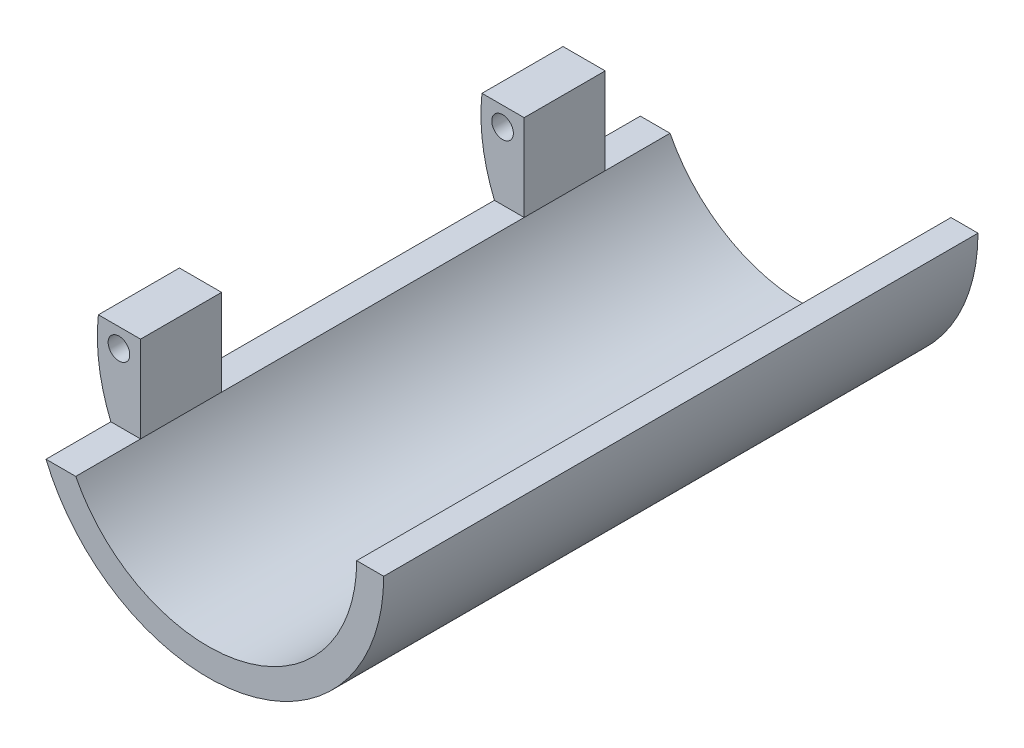
ISO-10303-21;
HEADER;
FILE_DESCRIPTION(('STEP AP214'),'2;1');
FILE_NAME('part.step','',(''),(''),'','','');
FILE_SCHEMA(('AUTOMOTIVE_DESIGN { 1 0 10303 214 1 1 1 1 }'));
ENDSEC;
DATA;
#1=APPLICATION_CONTEXT('core data for automotive mechanical design processes');
#2=APPLICATION_PROTOCOL_DEFINITION('international standard','automotive_design',2000,#1);
#3=PRODUCT_CONTEXT('',#1,'mechanical');
#4=PRODUCT('Part','Part','',(#3));
#5=PRODUCT_RELATED_PRODUCT_CATEGORY('part','',(#4));
#6=PRODUCT_DEFINITION_FORMATION('','',#4);
#7=PRODUCT_DEFINITION_CONTEXT('part definition',#1,'design');
#8=PRODUCT_DEFINITION('design','',#6,#7);
#9=PRODUCT_DEFINITION_SHAPE('','',#8);
#10=(LENGTH_UNIT() NAMED_UNIT(*) SI_UNIT(.MILLI.,.METRE.));
#11=(NAMED_UNIT(*) PLANE_ANGLE_UNIT() SI_UNIT($,.RADIAN.));
#12=(NAMED_UNIT(*) SI_UNIT($,.STERADIAN.) SOLID_ANGLE_UNIT());
#13=UNCERTAINTY_MEASURE_WITH_UNIT(LENGTH_MEASURE(1.E-05),#10,'distance_accuracy_value','');
#14=(GEOMETRIC_REPRESENTATION_CONTEXT(3) GLOBAL_UNCERTAINTY_ASSIGNED_CONTEXT((#13)) GLOBAL_UNIT_ASSIGNED_CONTEXT((#10,
#11,#12)) REPRESENTATION_CONTEXT('',''));
#15=CARTESIAN_POINT('',(0.,0.,0.));
#16=DIRECTION('',(0.,0.,1.));
#17=DIRECTION('',(1.,0.,0.));
#18=AXIS2_PLACEMENT_3D('',#15,#16,#17);
#19=CARTESIAN_POINT('',(-24.5,3.5100040032032,110.));
#20=DIRECTION('',(-1.,0.,0.));
#21=DIRECTION('',(0.,-1.,0.));
#22=AXIS2_PLACEMENT_3D('',#19,#20,#21);
#23=PLANE('',#22);
#24=DIRECTION('',(0.,0.,-1.));
#25=VECTOR('',#24,1.);
#26=CARTESIAN_POINT('',(-24.5,-12.4899959967968,110.));
#27=LINE('',#26,#25);
#28=CARTESIAN_POINT('',(-24.5,-12.4899959967968,98.));
#29=VERTEX_POINT('',#28);
#30=CARTESIAN_POINT('',(-24.5,-12.4899959967968,83.));
#31=VERTEX_POINT('',#30);
#32=EDGE_CURVE('E41',#29,#31,#27,.T.);
#33=ORIENTED_EDGE('',*,*,#32,.T.);
#34=DIRECTION('',(0.,-1.,0.));
#35=VECTOR('',#34,1.);
#36=CARTESIAN_POINT('',(-24.5,3.5100040032032,83.));
#37=LINE('',#36,#35);
#38=CARTESIAN_POINT('',(-24.5,3.5100040032032,83.));
#39=VERTEX_POINT('',#38);
#40=EDGE_CURVE('E170',#39,#31,#37,.T.);
#41=ORIENTED_EDGE('',*,*,#40,.F.);
#42=DIRECTION('',(0.,0.,-1.));
#43=VECTOR('',#42,1.);
#44=CARTESIAN_POINT('',(-24.5,3.5100040032032,110.));
#45=LINE('',#44,#43);
#46=CARTESIAN_POINT('',(-24.5,3.5100040032032,98.));
#47=VERTEX_POINT('',#46);
#48=EDGE_CURVE('E154',#47,#39,#45,.T.);
#49=ORIENTED_EDGE('',*,*,#48,.F.);
#50=DIRECTION('',(0.,1.,0.));
#51=VECTOR('',#50,1.);
#52=CARTESIAN_POINT('',(-24.5,3.5100040032032,98.));
#53=LINE('',#52,#51);
#54=EDGE_CURVE('E171',#29,#47,#53,.T.);
#55=ORIENTED_EDGE('',*,*,#54,.F.);
#56=EDGE_LOOP('',(#33,#41,#49,#55));
#57=FACE_BOUND('',#56,.T.);
#58=ADVANCED_FACE('F33',(#57),#23,.F.);
#59=CARTESIAN_POINT('',(-24.5,3.5100040032032,110.));
#60=DIRECTION('',(0.,-1.,0.));
#61=DIRECTION('',(1.,0.,0.));
#62=AXIS2_PLACEMENT_3D('',#59,#60,#61);
#63=PLANE('',#62);
#64=ORIENTED_EDGE('',*,*,#48,.T.);
#65=DIRECTION('',(1.,0.,0.));
#66=VECTOR('',#65,1.);
#67=CARTESIAN_POINT('',(-32.501,3.5100040032032,83.));
#68=LINE('',#67,#66);
#69=CARTESIAN_POINT('',(-32.3099036194399,3.5100040032032,83.));
#70=VERTEX_POINT('',#69);
#71=EDGE_CURVE('E189',#70,#39,#68,.T.);
#72=ORIENTED_EDGE('',*,*,#71,.F.);
#73=DIRECTION('',(0.,0.,-1.));
#74=VECTOR('',#73,1.);
#75=CARTESIAN_POINT('',(-32.3099036194399,3.5100040032032,110.));
#76=LINE('',#75,#74);
#77=CARTESIAN_POINT('',(-32.3099036194399,3.5100040032032,98.));
#78=VERTEX_POINT('',#77);
#79=EDGE_CURVE('E146',#78,#70,#76,.T.);
#80=ORIENTED_EDGE('',*,*,#79,.F.);
#81=DIRECTION('',(1.,0.,0.));
#82=VECTOR('',#81,1.);
#83=CARTESIAN_POINT('',(-32.501,3.5100040032032,98.));
#84=LINE('',#83,#82);
#85=EDGE_CURVE('E212',#78,#47,#84,.T.);
#86=ORIENTED_EDGE('',*,*,#85,.T.);
#87=EDGE_LOOP('',(#64,#72,#80,#86));
#88=FACE_BOUND('',#87,.T.);
#89=ADVANCED_FACE('F261',(#88),#63,.F.);
#90=CARTESIAN_POINT('',(-28.5,-1.13473143512402E-13,110.));
#91=DIRECTION('',(0.,0.,-1.));
#92=DIRECTION('',(-1.,0.,0.));
#93=AXIS2_PLACEMENT_3D('',#90,#91,#92);
#94=CYLINDRICAL_SURFACE('',#93,2.);
#95=CARTESIAN_POINT('',(-28.5,-1.13473143512402E-13,83.));
#96=DIRECTION('',(0.,0.,1.));
#97=DIRECTION('',(1.,0.,0.));
#98=AXIS2_PLACEMENT_3D('',#95,#96,#97);
#99=CIRCLE('',#98,2.);
#100=CARTESIAN_POINT('',(-26.5,-1.13473143512402E-13,83.));
#101=VERTEX_POINT('',#100);
#102=EDGE_CURVE('E185',#101,#101,#99,.F.);
#103=ORIENTED_EDGE('',*,*,#102,.T.);
#104=EDGE_LOOP('',(#103));
#105=FACE_BOUND('',#104,.T.);
#106=CARTESIAN_POINT('',(-28.5,-1.13473143512402E-13,98.));
#107=DIRECTION('',(0.,0.,-1.));
#108=DIRECTION('',(-1.,0.,0.));
#109=AXIS2_PLACEMENT_3D('',#106,#107,#108);
#110=CIRCLE('',#109,2.);
#111=CARTESIAN_POINT('',(-30.5,-1.13473143512402E-13,98.));
#112=VERTEX_POINT('',#111);
#113=EDGE_CURVE('E131',#112,#112,#110,.F.);
#114=ORIENTED_EDGE('',*,*,#113,.T.);
#115=EDGE_LOOP('',(#114));
#116=FACE_BOUND('',#115,.T.);
#117=ADVANCED_FACE('F250',(#105,#116),#94,.F.);
#118=CARTESIAN_POINT('',(0.,0.,110.));
#119=DIRECTION('',(0.,0.,1.));
#120=DIRECTION('',(1.,0.,0.));
#121=AXIS2_PLACEMENT_3D('',#118,#119,#120);
#122=PLANE('',#121);
#123=DIRECTION('',(1.,0.,0.));
#124=VECTOR('',#123,1.);
#125=CARTESIAN_POINT('',(-32.501,-12.4899959967968,110.));
#126=LINE('',#125,#124);
#127=CARTESIAN_POINT('',(-30.004166377355,-12.4899959967968,110.));
#128=VERTEX_POINT('',#127);
#129=CARTESIAN_POINT('',(-24.5,-12.4899959967968,110.));
#130=VERTEX_POINT('',#129);
#131=EDGE_CURVE('E211',#128,#130,#126,.T.);
#132=ORIENTED_EDGE('',*,*,#131,.F.);
#133=CARTESIAN_POINT('',(0.,0.,110.));
#134=DIRECTION('',(0.,0.,1.));
#135=DIRECTION('',(1.,0.,0.));
#136=AXIS2_PLACEMENT_3D('',#133,#134,#135);
#137=CIRCLE('',#136,32.5);
#138=CARTESIAN_POINT('',(32.5,0.,110.));
#139=VERTEX_POINT('',#138);
#140=EDGE_CURVE('E221',#128,#139,#137,.T.);
#141=ORIENTED_EDGE('',*,*,#140,.T.);
#142=DIRECTION('',(-1.,0.,0.));
#143=VECTOR('',#142,1.);
#144=CARTESIAN_POINT('',(27.5,0.,110.));
#145=LINE('',#144,#143);
#146=CARTESIAN_POINT('',(27.5,0.,110.));
#147=VERTEX_POINT('',#146);
#148=EDGE_CURVE('E224',#139,#147,#145,.T.);
#149=ORIENTED_EDGE('',*,*,#148,.T.);
#150=CARTESIAN_POINT('',(0.,0.,110.));
#151=DIRECTION('',(0.,0.,-1.));
#152=DIRECTION('',(1.,0.,0.));
#153=AXIS2_PLACEMENT_3D('',#150,#151,#152);
#154=CIRCLE('',#153,27.5);
#155=EDGE_CURVE('E218',#147,#130,#154,.T.);
#156=ORIENTED_EDGE('',*,*,#155,.T.);
#157=EDGE_LOOP('',(#132,#141,#149,#156));
#158=FACE_BOUND('',#157,.T.);
#159=ADVANCED_FACE('F271',(#158),#122,.T.);
#160=CARTESIAN_POINT('',(0.,0.,0.));
#161=DIRECTION('',(0.,0.,1.));
#162=DIRECTION('',(1.,0.,0.));
#163=AXIS2_PLACEMENT_3D('',#160,#161,#162);
#164=PLANE('',#163);
#165=CARTESIAN_POINT('',(0.,0.,0.));
#166=DIRECTION('',(0.,0.,1.));
#167=DIRECTION('',(1.,0.,0.));
#168=AXIS2_PLACEMENT_3D('',#165,#166,#167);
#169=CIRCLE('',#168,32.5);
#170=CARTESIAN_POINT('',(-30.004166377355,-12.4899959967968,0.));
#171=VERTEX_POINT('',#170);
#172=CARTESIAN_POINT('',(32.5,0.,0.));
#173=VERTEX_POINT('',#172);
#174=EDGE_CURVE('E227',#171,#173,#169,.T.);
#175=ORIENTED_EDGE('',*,*,#174,.F.);
#176=DIRECTION('',(1.,0.,0.));
#177=VECTOR('',#176,1.);
#178=CARTESIAN_POINT('',(-32.501,-12.4899959967968,0.));
#179=LINE('',#178,#177);
#180=CARTESIAN_POINT('',(-24.5,-12.4899959967968,0.));
#181=VERTEX_POINT('',#180);
#182=EDGE_CURVE('E132',#171,#181,#179,.T.);
#183=ORIENTED_EDGE('',*,*,#182,.T.);
#184=CARTESIAN_POINT('',(0.,0.,0.));
#185=DIRECTION('',(0.,0.,-1.));
#186=DIRECTION('',(1.,0.,0.));
#187=AXIS2_PLACEMENT_3D('',#184,#185,#186);
#188=CIRCLE('',#187,27.5);
#189=CARTESIAN_POINT('',(27.5,0.,0.));
#190=VERTEX_POINT('',#189);
#191=EDGE_CURVE('E214',#190,#181,#188,.T.);
#192=ORIENTED_EDGE('',*,*,#191,.F.);
#193=DIRECTION('',(-1.,0.,0.));
#194=VECTOR('',#193,1.);
#195=CARTESIAN_POINT('',(27.5,0.,0.));
#196=LINE('',#195,#194);
#197=EDGE_CURVE('E222',#173,#190,#196,.T.);
#198=ORIENTED_EDGE('',*,*,#197,.F.);
#199=EDGE_LOOP('',(#175,#183,#192,#198));
#200=FACE_BOUND('',#199,.T.);
#201=ADVANCED_FACE('F238',(#200),#164,.F.);
#202=CARTESIAN_POINT('',(0.,0.,110.));
#203=DIRECTION('',(0.,0.,-1.));
#204=DIRECTION('',(-1.,0.,0.));
#205=AXIS2_PLACEMENT_3D('',#202,#203,#204);
#206=CYLINDRICAL_SURFACE('',#205,27.5);
#207=ORIENTED_EDGE('',*,*,#191,.T.);
#208=DIRECTION('',(0.,0.,-1.));
#209=VECTOR('',#208,1.);
#210=CARTESIAN_POINT('',(-24.5,-12.4899959967968,12.));
#211=LINE('',#210,#209);
#212=CARTESIAN_POINT('',(-24.5,-12.4899959967968,12.));
#213=VERTEX_POINT('',#212);
#214=EDGE_CURVE('E142',#213,#181,#211,.T.);
#215=ORIENTED_EDGE('',*,*,#214,.F.);
#216=CARTESIAN_POINT('',(-24.5,-12.4899959967968,27.));
#217=VERTEX_POINT('',#216);
#218=EDGE_CURVE('E42',#217,#213,#27,.T.);
#219=ORIENTED_EDGE('',*,*,#218,.F.);
#220=DIRECTION('',(0.,0.,-1.));
#221=VECTOR('',#220,1.);
#222=CARTESIAN_POINT('',(-24.5,-12.4899959967968,83.));
#223=LINE('',#222,#221);
#224=EDGE_CURVE('E178',#31,#217,#223,.T.);
#225=ORIENTED_EDGE('',*,*,#224,.F.);
#226=ORIENTED_EDGE('',*,*,#32,.F.);
#227=EDGE_CURVE('E11',#130,#29,#27,.T.);
#228=ORIENTED_EDGE('',*,*,#227,.F.);
#229=ORIENTED_EDGE('',*,*,#155,.F.);
#230=DIRECTION('',(0.,0.,-1.));
#231=VECTOR('',#230,1.);
#232=CARTESIAN_POINT('',(27.5,0.,110.));
#233=LINE('',#232,#231);
#234=EDGE_CURVE('E151',#147,#190,#233,.T.);
#235=ORIENTED_EDGE('',*,*,#234,.T.);
#236=EDGE_LOOP('',(#207,#215,#219,#225,#226,#228,#229,#235));
#237=FACE_BOUND('',#236,.T.);
#238=ADVANCED_FACE('F35',(#237),#206,.F.);
#239=ORIENTED_EDGE('',*,*,#218,.T.);
#240=DIRECTION('',(0.,-1.,0.));
#241=VECTOR('',#240,1.);
#242=CARTESIAN_POINT('',(-24.5,3.5100040032032,12.));
#243=LINE('',#242,#241);
#244=CARTESIAN_POINT('',(-24.5,3.5100040032032,12.));
#245=VERTEX_POINT('',#244);
#246=EDGE_CURVE('E274',#245,#213,#243,.T.);
#247=ORIENTED_EDGE('',*,*,#246,.F.);
#248=CARTESIAN_POINT('',(-24.5,3.5100040032032,27.));
#249=VERTEX_POINT('',#248);
#250=EDGE_CURVE('E141',#249,#245,#45,.T.);
#251=ORIENTED_EDGE('',*,*,#250,.F.);
#252=DIRECTION('',(0.,1.,0.));
#253=VECTOR('',#252,1.);
#254=CARTESIAN_POINT('',(-24.5,3.5100040032032,27.));
#255=LINE('',#254,#253);
#256=EDGE_CURVE('E181',#217,#249,#255,.T.);
#257=ORIENTED_EDGE('',*,*,#256,.F.);
#258=EDGE_LOOP('',(#239,#247,#251,#257));
#259=FACE_BOUND('',#258,.T.);
#260=ADVANCED_FACE('F289',(#259),#23,.F.);
#261=ORIENTED_EDGE('',*,*,#250,.T.);
#262=DIRECTION('',(1.,0.,0.));
#263=VECTOR('',#262,1.);
#264=CARTESIAN_POINT('',(-32.501,3.5100040032032,12.));
#265=LINE('',#264,#263);
#266=CARTESIAN_POINT('',(-32.3099036194399,3.5100040032032,12.));
#267=VERTEX_POINT('',#266);
#268=EDGE_CURVE('E126',#267,#245,#265,.T.);
#269=ORIENTED_EDGE('',*,*,#268,.F.);
#270=CARTESIAN_POINT('',(-32.3099036194399,3.5100040032032,27.));
#271=VERTEX_POINT('',#270);
#272=EDGE_CURVE('E139',#271,#267,#76,.T.);
#273=ORIENTED_EDGE('',*,*,#272,.F.);
#274=DIRECTION('',(1.,0.,0.));
#275=VECTOR('',#274,1.);
#276=CARTESIAN_POINT('',(-32.501,3.5100040032032,27.));
#277=LINE('',#276,#275);
#278=EDGE_CURVE('E192',#271,#249,#277,.T.);
#279=ORIENTED_EDGE('',*,*,#278,.T.);
#280=EDGE_LOOP('',(#261,#269,#273,#279));
#281=FACE_BOUND('',#280,.T.);
#282=ADVANCED_FACE('F137',(#281),#63,.F.);
#283=CARTESIAN_POINT('',(0.,0.,110.));
#284=DIRECTION('',(0.,0.,-1.));
#285=DIRECTION('',(-1.,0.,0.));
#286=AXIS2_PLACEMENT_3D('',#283,#284,#285);
#287=CYLINDRICAL_SURFACE('',#286,32.5);
#288=CARTESIAN_POINT('',(0.,0.,12.));
#289=DIRECTION('',(0.,0.,1.));
#290=DIRECTION('',(1.,0.,0.));
#291=AXIS2_PLACEMENT_3D('',#288,#289,#290);
#292=CIRCLE('',#291,32.5);
#293=CARTESIAN_POINT('',(-30.004166377355,-12.4899959967968,12.));
#294=VERTEX_POINT('',#293);
#295=EDGE_CURVE('E122',#294,#267,#292,.F.);
#296=ORIENTED_EDGE('',*,*,#295,.F.);
#297=DIRECTION('',(0.,0.,-1.));
#298=VECTOR('',#297,1.);
#299=CARTESIAN_POINT('',(-30.004166377355,-12.4899959967968,110.));
#300=LINE('',#299,#298);
#301=EDGE_CURVE('E49',#171,#294,#300,.F.);
#302=ORIENTED_EDGE('',*,*,#301,.F.);
#303=ORIENTED_EDGE('',*,*,#174,.T.);
#304=DIRECTION('',(0.,0.,-1.));
#305=VECTOR('',#304,1.);
#306=CARTESIAN_POINT('',(32.5,0.,110.));
#307=LINE('',#306,#305);
#308=EDGE_CURVE('E147',#139,#173,#307,.T.);
#309=ORIENTED_EDGE('',*,*,#308,.F.);
#310=ORIENTED_EDGE('',*,*,#140,.F.);
#311=DIRECTION('',(0.,0.,-1.));
#312=VECTOR('',#311,1.);
#313=CARTESIAN_POINT('',(-30.004166377355,-12.4899959967968,110.));
#314=LINE('',#313,#312);
#315=CARTESIAN_POINT('',(-30.004166377355,-12.4899959967968,98.));
#316=VERTEX_POINT('',#315);
#317=EDGE_CURVE('E206',#316,#128,#314,.F.);
#318=ORIENTED_EDGE('',*,*,#317,.F.);
#319=CARTESIAN_POINT('',(0.,0.,98.));
#320=DIRECTION('',(0.,0.,-1.));
#321=DIRECTION('',(-1.,0.,0.));
#322=AXIS2_PLACEMENT_3D('',#319,#320,#321);
#323=CIRCLE('',#322,32.5);
#324=EDGE_CURVE('E208',#78,#316,#323,.F.);
#325=ORIENTED_EDGE('',*,*,#324,.F.);
#326=ORIENTED_EDGE('',*,*,#79,.T.);
#327=CARTESIAN_POINT('',(0.,0.,83.));
#328=DIRECTION('',(0.,0.,1.));
#329=DIRECTION('',(1.,0.,0.));
#330=AXIS2_PLACEMENT_3D('',#327,#328,#329);
#331=CIRCLE('',#330,32.5);
#332=CARTESIAN_POINT('',(-30.004166377355,-12.4899959967968,83.));
#333=VERTEX_POINT('',#332);
#334=EDGE_CURVE('E203',#333,#70,#331,.F.);
#335=ORIENTED_EDGE('',*,*,#334,.F.);
#336=DIRECTION('',(0.,0.,-1.));
#337=VECTOR('',#336,1.);
#338=CARTESIAN_POINT('',(-30.004166377355,-12.4899959967968,110.));
#339=LINE('',#338,#337);
#340=CARTESIAN_POINT('',(-30.004166377355,-12.4899959967968,27.));
#341=VERTEX_POINT('',#340);
#342=EDGE_CURVE('E191',#341,#333,#339,.F.);
#343=ORIENTED_EDGE('',*,*,#342,.F.);
#344=CARTESIAN_POINT('',(0.,0.,27.));
#345=DIRECTION('',(0.,0.,-1.));
#346=DIRECTION('',(-1.,0.,0.));
#347=AXIS2_PLACEMENT_3D('',#344,#345,#346);
#348=CIRCLE('',#347,32.5);
#349=EDGE_CURVE('E57',#271,#341,#348,.F.);
#350=ORIENTED_EDGE('',*,*,#349,.F.);
#351=ORIENTED_EDGE('',*,*,#272,.T.);
#352=EDGE_LOOP('',(#296,#302,#303,#309,#310,#318,#325,#326,#335,#343,#350,#351));
#353=FACE_BOUND('',#352,.T.);
#354=ADVANCED_FACE('F144',(#353),#287,.T.);
#355=CARTESIAN_POINT('',(27.5,0.,110.));
#356=DIRECTION('',(0.,-1.,0.));
#357=DIRECTION('',(0.,0.,-1.));
#358=AXIS2_PLACEMENT_3D('',#355,#356,#357);
#359=PLANE('',#358);
#360=ORIENTED_EDGE('',*,*,#197,.T.);
#361=ORIENTED_EDGE('',*,*,#234,.F.);
#362=ORIENTED_EDGE('',*,*,#148,.F.);
#363=ORIENTED_EDGE('',*,*,#308,.T.);
#364=EDGE_LOOP('',(#360,#361,#362,#363));
#365=FACE_BOUND('',#364,.T.);
#366=ADVANCED_FACE('F273',(#365),#359,.F.);
#367=CARTESIAN_POINT('',(-32.501,3.5100040032032,98.));
#368=DIRECTION('',(0.,0.,-1.));
#369=DIRECTION('',(-1.,0.,0.));
#370=AXIS2_PLACEMENT_3D('',#367,#368,#369);
#371=PLANE('',#370);
#372=ORIENTED_EDGE('',*,*,#113,.F.);
#373=EDGE_LOOP('',(#372));
#374=FACE_BOUND('',#373,.T.);
#375=ORIENTED_EDGE('',*,*,#324,.T.);
#376=DIRECTION('',(1.,0.,0.));
#377=VECTOR('',#376,1.);
#378=CARTESIAN_POINT('',(-32.501,-12.4899959967968,98.));
#379=LINE('',#378,#377);
#380=EDGE_CURVE('E215',#316,#29,#379,.T.);
#381=ORIENTED_EDGE('',*,*,#380,.T.);
#382=ORIENTED_EDGE('',*,*,#54,.T.);
#383=ORIENTED_EDGE('',*,*,#85,.F.);
#384=EDGE_LOOP('',(#375,#381,#382,#383));
#385=FACE_BOUND('',#384,.T.);
#386=ADVANCED_FACE('F267',(#374,#385),#371,.F.);
#387=CARTESIAN_POINT('',(-32.501,-12.4899959967968,98.));
#388=DIRECTION('',(0.,-1.,0.));
#389=DIRECTION('',(1.,0.,0.));
#390=AXIS2_PLACEMENT_3D('',#387,#388,#389);
#391=PLANE('',#390);
#392=ORIENTED_EDGE('',*,*,#317,.T.);
#393=ORIENTED_EDGE('',*,*,#131,.T.);
#394=ORIENTED_EDGE('',*,*,#227,.T.);
#395=ORIENTED_EDGE('',*,*,#380,.F.);
#396=EDGE_LOOP('',(#392,#393,#394,#395));
#397=FACE_BOUND('',#396,.T.);
#398=ADVANCED_FACE('F257',(#397),#391,.F.);
#399=CARTESIAN_POINT('',(-32.501,3.5100040032032,83.));
#400=DIRECTION('',(0.,0.,1.));
#401=DIRECTION('',(1.,0.,0.));
#402=AXIS2_PLACEMENT_3D('',#399,#400,#401);
#403=PLANE('',#402);
#404=ORIENTED_EDGE('',*,*,#102,.F.);
#405=EDGE_LOOP('',(#404));
#406=FACE_BOUND('',#405,.T.);
#407=ORIENTED_EDGE('',*,*,#334,.T.);
#408=ORIENTED_EDGE('',*,*,#71,.T.);
#409=ORIENTED_EDGE('',*,*,#40,.T.);
#410=DIRECTION('',(1.,0.,0.));
#411=VECTOR('',#410,1.);
#412=CARTESIAN_POINT('',(-32.501,-12.4899959967968,83.));
#413=LINE('',#412,#411);
#414=EDGE_CURVE('E183',#333,#31,#413,.T.);
#415=ORIENTED_EDGE('',*,*,#414,.F.);
#416=EDGE_LOOP('',(#407,#408,#409,#415));
#417=FACE_BOUND('',#416,.T.);
#418=ADVANCED_FACE('F253',(#406,#417),#403,.F.);
#419=CARTESIAN_POINT('',(-32.501,3.5100040032032,27.));
#420=DIRECTION('',(0.,0.,-1.));
#421=DIRECTION('',(-1.,0.,0.));
#422=AXIS2_PLACEMENT_3D('',#419,#420,#421);
#423=PLANE('',#422);
#424=CARTESIAN_POINT('',(-28.5,-1.13473143512402E-13,27.));
#425=DIRECTION('',(0.,0.,-1.));
#426=DIRECTION('',(-1.,0.,0.));
#427=AXIS2_PLACEMENT_3D('',#424,#425,#426);
#428=CIRCLE('',#427,2.);
#429=CARTESIAN_POINT('',(-30.5,-1.13473143512402E-13,27.));
#430=VERTEX_POINT('',#429);
#431=EDGE_CURVE('E200',#430,#430,#428,.F.);
#432=ORIENTED_EDGE('',*,*,#431,.F.);
#433=EDGE_LOOP('',(#432));
#434=FACE_BOUND('',#433,.T.);
#435=ORIENTED_EDGE('',*,*,#349,.T.);
#436=DIRECTION('',(1.,0.,0.));
#437=VECTOR('',#436,1.);
#438=CARTESIAN_POINT('',(-32.501,-12.4899959967968,27.));
#439=LINE('',#438,#437);
#440=EDGE_CURVE('E194',#341,#217,#439,.T.);
#441=ORIENTED_EDGE('',*,*,#440,.T.);
#442=ORIENTED_EDGE('',*,*,#256,.T.);
#443=ORIENTED_EDGE('',*,*,#278,.F.);
#444=EDGE_LOOP('',(#435,#441,#442,#443));
#445=FACE_BOUND('',#444,.T.);
#446=ADVANCED_FACE('F256',(#434,#445),#423,.F.);
#447=CARTESIAN_POINT('',(-32.501,-12.4899959967968,83.));
#448=DIRECTION('',(0.,-1.,0.));
#449=DIRECTION('',(0.,0.,-1.));
#450=AXIS2_PLACEMENT_3D('',#447,#448,#449);
#451=PLANE('',#450);
#452=ORIENTED_EDGE('',*,*,#342,.T.);
#453=ORIENTED_EDGE('',*,*,#414,.T.);
#454=ORIENTED_EDGE('',*,*,#224,.T.);
#455=ORIENTED_EDGE('',*,*,#440,.F.);
#456=EDGE_LOOP('',(#452,#453,#454,#455));
#457=FACE_BOUND('',#456,.T.);
#458=ADVANCED_FACE('F278',(#457),#451,.F.);
#459=CARTESIAN_POINT('',(-32.501,-12.4899959967968,12.));
#460=DIRECTION('',(0.,-1.,0.));
#461=DIRECTION('',(1.,0.,0.));
#462=AXIS2_PLACEMENT_3D('',#459,#460,#461);
#463=PLANE('',#462);
#464=ORIENTED_EDGE('',*,*,#301,.T.);
#465=DIRECTION('',(1.,0.,0.));
#466=VECTOR('',#465,1.);
#467=CARTESIAN_POINT('',(-32.501,-12.4899959967968,12.));
#468=LINE('',#467,#466);
#469=EDGE_CURVE('E128',#294,#213,#468,.T.);
#470=ORIENTED_EDGE('',*,*,#469,.T.);
#471=ORIENTED_EDGE('',*,*,#214,.T.);
#472=ORIENTED_EDGE('',*,*,#182,.F.);
#473=EDGE_LOOP('',(#464,#470,#471,#472));
#474=FACE_BOUND('',#473,.T.);
#475=ADVANCED_FACE('F276',(#474),#463,.F.);
#476=CARTESIAN_POINT('',(-32.501,3.5100040032032,12.));
#477=DIRECTION('',(0.,0.,1.));
#478=DIRECTION('',(1.,0.,0.));
#479=AXIS2_PLACEMENT_3D('',#476,#477,#478);
#480=PLANE('',#479);
#481=CARTESIAN_POINT('',(-28.5,-1.13473143512402E-13,12.));
#482=DIRECTION('',(0.,0.,1.));
#483=DIRECTION('',(1.,0.,0.));
#484=AXIS2_PLACEMENT_3D('',#481,#482,#483);
#485=CIRCLE('',#484,2.);
#486=CARTESIAN_POINT('',(-26.5,-1.13473143512402E-13,12.));
#487=VERTEX_POINT('',#486);
#488=EDGE_CURVE('E199',#487,#487,#485,.F.);
#489=ORIENTED_EDGE('',*,*,#488,.F.);
#490=EDGE_LOOP('',(#489));
#491=FACE_BOUND('',#490,.T.);
#492=ORIENTED_EDGE('',*,*,#295,.T.);
#493=ORIENTED_EDGE('',*,*,#268,.T.);
#494=ORIENTED_EDGE('',*,*,#246,.T.);
#495=ORIENTED_EDGE('',*,*,#469,.F.);
#496=EDGE_LOOP('',(#492,#493,#494,#495));
#497=FACE_BOUND('',#496,.T.);
#498=ADVANCED_FACE('F124',(#491,#497),#480,.F.);
#499=ORIENTED_EDGE('',*,*,#488,.T.);
#500=EDGE_LOOP('',(#499));
#501=FACE_BOUND('',#500,.T.);
#502=ORIENTED_EDGE('',*,*,#431,.T.);
#503=EDGE_LOOP('',(#502));
#504=FACE_BOUND('',#503,.T.);
#505=ADVANCED_FACE('F284',(#501,#504),#94,.F.);
#506=CLOSED_SHELL('',(#58,#89,#117,#159,#201,#238,#260,#282,#354,#366,#386,#398,#418,#446,#458,
#475,#498,#505));
#507=MANIFOLD_SOLID_BREP('B2',#506);
#508=ADVANCED_BREP_SHAPE_REPRESENTATION('',(#18,#507),#14);
#509=SHAPE_DEFINITION_REPRESENTATION(#9,#508);
ENDSEC;
END-ISO-10303-21;
